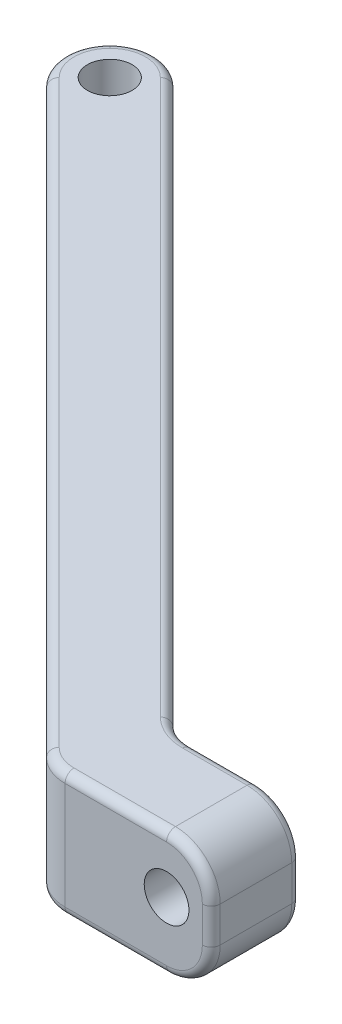
ISO-10303-21;
HEADER;
FILE_DESCRIPTION(('STEP AP214'),'2;1');
FILE_NAME('part.step','',(''),(''),'','','');
FILE_SCHEMA(('AUTOMOTIVE_DESIGN { 1 0 10303 214 1 1 1 1 }'));
ENDSEC;
DATA;
#1=APPLICATION_CONTEXT('core data for automotive mechanical design processes');
#2=APPLICATION_PROTOCOL_DEFINITION('international standard','automotive_design',2000,#1);
#3=PRODUCT_CONTEXT('',#1,'mechanical');
#4=PRODUCT('Part','Part','',(#3));
#5=PRODUCT_RELATED_PRODUCT_CATEGORY('part','',(#4));
#6=PRODUCT_DEFINITION_FORMATION('','',#4);
#7=PRODUCT_DEFINITION_CONTEXT('part definition',#1,'design');
#8=PRODUCT_DEFINITION('design','',#6,#7);
#9=PRODUCT_DEFINITION_SHAPE('','',#8);
#10=(LENGTH_UNIT() NAMED_UNIT(*) SI_UNIT(.MILLI.,.METRE.));
#11=(NAMED_UNIT(*) PLANE_ANGLE_UNIT() SI_UNIT($,.RADIAN.));
#12=(NAMED_UNIT(*) SI_UNIT($,.STERADIAN.) SOLID_ANGLE_UNIT());
#13=UNCERTAINTY_MEASURE_WITH_UNIT(LENGTH_MEASURE(1.E-05),#10,'distance_accuracy_value','');
#14=(GEOMETRIC_REPRESENTATION_CONTEXT(3) GLOBAL_UNCERTAINTY_ASSIGNED_CONTEXT((#13)) GLOBAL_UNIT_ASSIGNED_CONTEXT((#10,
#11,#12)) REPRESENTATION_CONTEXT('',''));
#15=CARTESIAN_POINT('',(0.,0.,0.));
#16=DIRECTION('',(0.,0.,1.));
#17=DIRECTION('',(1.,0.,0.));
#18=AXIS2_PLACEMENT_3D('',#15,#16,#17);
#19=CARTESIAN_POINT('',(0.,13.97,0.));
#20=DIRECTION('',(0.,-1.,0.));
#21=DIRECTION('',(0.,0.,-1.));
#22=AXIS2_PLACEMENT_3D('',#19,#20,#21);
#23=PLANE('',#22);
#24=DIRECTION('',(0.,0.,-1.));
#25=VECTOR('',#24,1.);
#26=CARTESIAN_POINT('',(76.2,13.97,0.));
#27=LINE('',#26,#25);
#28=CARTESIAN_POINT('',(76.2,13.97,68.85));
#29=VERTEX_POINT('',#28);
#30=CARTESIAN_POINT('',(76.2,13.97,60.85));
#31=VERTEX_POINT('',#30);
#32=EDGE_CURVE('E470',#29,#31,#27,.T.);
#33=ORIENTED_EDGE('',*,*,#32,.T.);
#34=DIRECTION('',(-1.,0.,0.));
#35=VECTOR('',#34,1.);
#36=CARTESIAN_POINT('',(0.,13.97,60.85));
#37=LINE('',#36,#35);
#38=CARTESIAN_POINT('',(68.9921356237317,13.97,60.85));
#39=VERTEX_POINT('',#38);
#40=EDGE_CURVE('E402',#31,#39,#37,.T.);
#41=ORIENTED_EDGE('',*,*,#40,.T.);
#42=CARTESIAN_POINT('',(68.9921356237317,13.97,54.85));
#43=DIRECTION('',(0.,-1.,0.));
#44=DIRECTION('',(0.,0.,-1.));
#45=AXIS2_PLACEMENT_3D('',#42,#43,#44);
#46=CIRCLE('',#45,6.);
#47=CARTESIAN_POINT('',(64.7494949366124,13.97,59.0926406871193));
#48=VERTEX_POINT('',#47);
#49=EDGE_CURVE('E399',#39,#48,#46,.T.);
#50=ORIENTED_EDGE('',*,*,#49,.T.);
#51=DIRECTION('',(-0.707106781186552,0.,-0.707106781186543));
#52=VECTOR('',#51,1.);
#53=CARTESIAN_POINT('',(2.82842712474617,13.97,-2.82842712474621));
#54=LINE('',#53,#52);
#55=CARTESIAN_POINT('',(2.82842712474617,13.97,-2.82842712474621));
#56=VERTEX_POINT('',#55);
#57=EDGE_CURVE('E396',#48,#56,#54,.T.);
#58=ORIENTED_EDGE('',*,*,#57,.T.);
#59=CARTESIAN_POINT('',(0.,13.97,0.));
#60=DIRECTION('',(0.,-1.,0.));
#61=DIRECTION('',(0.,0.,-1.));
#62=AXIS2_PLACEMENT_3D('',#59,#60,#61);
#63=CIRCLE('',#62,4.);
#64=CARTESIAN_POINT('',(-2.82842712474621,13.97,-2.82842712474618));
#65=VERTEX_POINT('',#64);
#66=EDGE_CURVE('E393',#56,#65,#63,.F.);
#67=ORIENTED_EDGE('',*,*,#66,.T.);
#68=CARTESIAN_POINT('',(0.,13.97,0.));
#69=DIRECTION('',(0.,-1.,0.));
#70=DIRECTION('',(0.,0.,-1.));
#71=AXIS2_PLACEMENT_3D('',#68,#69,#70);
#72=CIRCLE('',#71,4.);
#73=CARTESIAN_POINT('',(-2.82842712474617,13.97,2.82842712474621));
#74=VERTEX_POINT('',#73);
#75=EDGE_CURVE('E390',#65,#74,#72,.F.);
#76=ORIENTED_EDGE('',*,*,#75,.T.);
#77=DIRECTION('',(0.707106781186552,0.,0.707106781186543));
#78=VECTOR('',#77,1.);
#79=CARTESIAN_POINT('',(-2.82842712474618,13.97,2.82842712474621));
#80=LINE('',#79,#78);
#81=CARTESIAN_POINT('',(62.0215728752546,13.97,67.6784271247462));
#82=VERTEX_POINT('',#81);
#83=EDGE_CURVE('E387',#74,#82,#80,.T.);
#84=ORIENTED_EDGE('',*,*,#83,.T.);
#85=CARTESIAN_POINT('',(64.8500000000007,13.97,64.85));
#86=DIRECTION('',(0.,-1.,0.));
#87=DIRECTION('',(0.,0.,-1.));
#88=AXIS2_PLACEMENT_3D('',#85,#86,#87);
#89=CIRCLE('',#88,4.);
#90=CARTESIAN_POINT('',(64.8500000000007,13.97,68.85));
#91=VERTEX_POINT('',#90);
#92=EDGE_CURVE('E384',#82,#91,#89,.F.);
#93=ORIENTED_EDGE('',*,*,#92,.T.);
#94=DIRECTION('',(1.,0.,0.));
#95=VECTOR('',#94,1.);
#96=CARTESIAN_POINT('',(0.,13.97,68.85));
#97=LINE('',#96,#95);
#98=EDGE_CURVE('E381',#91,#29,#97,.T.);
#99=ORIENTED_EDGE('',*,*,#98,.T.);
#100=EDGE_LOOP('',(#33,#41,#50,#58,#67,#76,#84,#93,#99));
#101=FACE_BOUND('',#100,.T.);
#102=CARTESIAN_POINT('',(0.,13.97,0.));
#103=DIRECTION('',(0.,1.,0.));
#104=DIRECTION('',(0.,0.,1.));
#105=AXIS2_PLACEMENT_3D('',#102,#103,#104);
#106=CIRCLE('',#105,2.5);
#107=CARTESIAN_POINT('',(0.,13.97,2.5));
#108=VERTEX_POINT('',#107);
#109=EDGE_CURVE('E214',#108,#108,#106,.T.);
#110=ORIENTED_EDGE('',*,*,#109,.F.);
#111=EDGE_LOOP('',(#110));
#112=FACE_BOUND('',#111,.T.);
#113=ADVANCED_FACE('F41',(#101,#112),#23,.F.);
#114=CARTESIAN_POINT('',(0.,0.,0.));
#115=DIRECTION('',(0.,-1.,0.));
#116=DIRECTION('',(0.,0.,-1.));
#117=AXIS2_PLACEMENT_3D('',#114,#115,#116);
#118=PLANE('',#117);
#119=CARTESIAN_POINT('',(68.9921356237317,0.,54.85));
#120=DIRECTION('',(0.,-1.,0.));
#121=DIRECTION('',(0.,0.,-1.));
#122=AXIS2_PLACEMENT_3D('',#119,#120,#121);
#123=CIRCLE('',#122,6.);
#124=CARTESIAN_POINT('',(64.7494949366124,0.,59.0926406871193));
#125=VERTEX_POINT('',#124);
#126=CARTESIAN_POINT('',(68.9921356237317,0.,60.85));
#127=VERTEX_POINT('',#126);
#128=EDGE_CURVE('E196',#125,#127,#123,.F.);
#129=ORIENTED_EDGE('',*,*,#128,.T.);
#130=DIRECTION('',(-1.,0.,0.));
#131=VECTOR('',#130,1.);
#132=CARTESIAN_POINT('',(76.2,0.,60.85));
#133=LINE('',#132,#131);
#134=CARTESIAN_POINT('',(76.2,0.,60.85));
#135=VERTEX_POINT('',#134);
#136=EDGE_CURVE('E189',#127,#135,#133,.F.);
#137=ORIENTED_EDGE('',*,*,#136,.T.);
#138=DIRECTION('',(0.,0.,-1.));
#139=VECTOR('',#138,1.);
#140=CARTESIAN_POINT('',(76.2,0.,69.85));
#141=LINE('',#140,#139);
#142=CARTESIAN_POINT('',(76.2,0.,68.85));
#143=VERTEX_POINT('',#142);
#144=EDGE_CURVE('E193',#135,#143,#141,.F.);
#145=ORIENTED_EDGE('',*,*,#144,.T.);
#146=DIRECTION('',(1.,0.,0.));
#147=VECTOR('',#146,1.);
#148=CARTESIAN_POINT('',(64.8500000000007,0.,68.85));
#149=LINE('',#148,#147);
#150=CARTESIAN_POINT('',(64.8500000000007,0.,68.85));
#151=VERTEX_POINT('',#150);
#152=EDGE_CURVE('E315',#143,#151,#149,.F.);
#153=ORIENTED_EDGE('',*,*,#152,.T.);
#154=CARTESIAN_POINT('',(64.8500000000007,0.,64.85));
#155=DIRECTION('',(0.,-1.,0.));
#156=DIRECTION('',(0.,0.,-1.));
#157=AXIS2_PLACEMENT_3D('',#154,#155,#156);
#158=CIRCLE('',#157,4.);
#159=CARTESIAN_POINT('',(62.0215728752546,0.,67.6784271247462));
#160=VERTEX_POINT('',#159);
#161=EDGE_CURVE('E312',#151,#160,#158,.T.);
#162=ORIENTED_EDGE('',*,*,#161,.T.);
#163=DIRECTION('',(0.707106781186552,0.,0.707106781186543));
#164=VECTOR('',#163,1.);
#165=CARTESIAN_POINT('',(-2.82842712474617,0.,2.82842712474621));
#166=LINE('',#165,#164);
#167=CARTESIAN_POINT('',(-2.82842712474617,0.,2.82842712474621));
#168=VERTEX_POINT('',#167);
#169=EDGE_CURVE('E309',#160,#168,#166,.F.);
#170=ORIENTED_EDGE('',*,*,#169,.T.);
#171=CARTESIAN_POINT('',(0.,0.,0.));
#172=DIRECTION('',(0.,-1.,0.));
#173=DIRECTION('',(0.,0.,-1.));
#174=AXIS2_PLACEMENT_3D('',#171,#172,#173);
#175=CIRCLE('',#174,4.);
#176=CARTESIAN_POINT('',(-2.82842712474621,0.,-2.82842712474618));
#177=VERTEX_POINT('',#176);
#178=EDGE_CURVE('E318',#168,#177,#175,.T.);
#179=ORIENTED_EDGE('',*,*,#178,.T.);
#180=CARTESIAN_POINT('',(0.,0.,0.));
#181=DIRECTION('',(0.,-1.,0.));
#182=DIRECTION('',(0.,0.,-1.));
#183=AXIS2_PLACEMENT_3D('',#180,#181,#182);
#184=CIRCLE('',#183,4.);
#185=CARTESIAN_POINT('',(2.82842712474617,0.,-2.82842712474621));
#186=VERTEX_POINT('',#185);
#187=EDGE_CURVE('E322',#177,#186,#184,.T.);
#188=ORIENTED_EDGE('',*,*,#187,.T.);
#189=DIRECTION('',(-0.707106781186552,0.,-0.707106781186543));
#190=VECTOR('',#189,1.);
#191=CARTESIAN_POINT('',(64.7494949366124,0.,59.0926406871193));
#192=LINE('',#191,#190);
#193=EDGE_CURVE('E325',#186,#125,#192,.F.);
#194=ORIENTED_EDGE('',*,*,#193,.T.);
#195=EDGE_LOOP('',(#129,#137,#145,#153,#162,#170,#179,#188,#194));
#196=FACE_BOUND('',#195,.T.);
#197=CARTESIAN_POINT('',(0.,0.,0.));
#198=DIRECTION('',(0.,1.,0.));
#199=DIRECTION('',(0.,0.,1.));
#200=AXIS2_PLACEMENT_3D('',#197,#198,#199);
#201=CIRCLE('',#200,2.5);
#202=CARTESIAN_POINT('',(0.,0.,2.5));
#203=VERTEX_POINT('',#202);
#204=EDGE_CURVE('E903',#203,#203,#201,.T.);
#205=ORIENTED_EDGE('',*,*,#204,.T.);
#206=EDGE_LOOP('',(#205));
#207=FACE_BOUND('',#206,.T.);
#208=ADVANCED_FACE('F191',(#196,#207),#118,.T.);
#209=CARTESIAN_POINT('',(81.2,13.97,59.85));
#210=DIRECTION('',(-1.,0.,0.));
#211=DIRECTION('',(0.,0.,1.));
#212=AXIS2_PLACEMENT_3D('',#209,#210,#211);
#213=PLANE('',#212);
#214=DIRECTION('',(0.,0.,-1.));
#215=VECTOR('',#214,1.);
#216=CARTESIAN_POINT('',(81.2,5.,59.85));
#217=LINE('',#216,#215);
#218=CARTESIAN_POINT('',(81.2,5.,68.85));
#219=VERTEX_POINT('',#218);
#220=CARTESIAN_POINT('',(81.2,5.,60.85));
#221=VERTEX_POINT('',#220);
#222=EDGE_CURVE('E489',#219,#221,#217,.T.);
#223=ORIENTED_EDGE('',*,*,#222,.T.);
#224=DIRECTION('',(0.,-1.,0.));
#225=VECTOR('',#224,1.);
#226=CARTESIAN_POINT('',(81.2,13.97,60.85));
#227=LINE('',#226,#225);
#228=CARTESIAN_POINT('',(81.2,8.97,60.85));
#229=VERTEX_POINT('',#228);
#230=EDGE_CURVE('E372',#221,#229,#227,.F.);
#231=ORIENTED_EDGE('',*,*,#230,.T.);
#232=DIRECTION('',(0.,0.,-1.));
#233=VECTOR('',#232,1.);
#234=CARTESIAN_POINT('',(81.2,8.97,59.85));
#235=LINE('',#234,#233);
#236=CARTESIAN_POINT('',(81.2,8.97,68.85));
#237=VERTEX_POINT('',#236);
#238=EDGE_CURVE('E485',#229,#237,#235,.F.);
#239=ORIENTED_EDGE('',*,*,#238,.T.);
#240=DIRECTION('',(0.,-1.,0.));
#241=VECTOR('',#240,1.);
#242=CARTESIAN_POINT('',(81.2,13.97,68.85));
#243=LINE('',#242,#241);
#244=EDGE_CURVE('E226',#237,#219,#243,.T.);
#245=ORIENTED_EDGE('',*,*,#244,.T.);
#246=EDGE_LOOP('',(#223,#231,#239,#245));
#247=FACE_BOUND('',#246,.T.);
#248=ADVANCED_FACE('F568',(#247),#213,.F.);
#249=CARTESIAN_POINT('',(66.9210678118662,13.97,59.85));
#250=DIRECTION('',(0.,0.,1.));
#251=DIRECTION('',(1.,0.,0.));
#252=AXIS2_PLACEMENT_3D('',#249,#250,#251);
#253=PLANE('',#252);
#254=CARTESIAN_POINT('',(76.2,7.62,59.85));
#255=DIRECTION('',(0.,0.,-1.));
#256=DIRECTION('',(-1.,0.,0.));
#257=AXIS2_PLACEMENT_3D('',#254,#255,#256);
#258=CIRCLE('',#257,2.49999999999999);
#259=CARTESIAN_POINT('',(73.7,7.62,59.85));
#260=VERTEX_POINT('',#259);
#261=EDGE_CURVE('E296',#260,#260,#258,.T.);
#262=ORIENTED_EDGE('',*,*,#261,.F.);
#263=EDGE_LOOP('',(#262));
#264=FACE_BOUND('',#263,.T.);
#265=CARTESIAN_POINT('',(76.2,5.,59.85));
#266=DIRECTION('',(0.,0.,1.));
#267=DIRECTION('',(1.,0.,0.));
#268=AXIS2_PLACEMENT_3D('',#265,#266,#267);
#269=CIRCLE('',#268,4.);
#270=CARTESIAN_POINT('',(80.2,5.,59.85));
#271=VERTEX_POINT('',#270);
#272=CARTESIAN_POINT('',(76.2,0.999999999999999,59.85));
#273=VERTEX_POINT('',#272);
#274=EDGE_CURVE('E363',#271,#273,#269,.F.);
#275=ORIENTED_EDGE('',*,*,#274,.T.);
#276=DIRECTION('',(-1.,0.,0.));
#277=VECTOR('',#276,1.);
#278=CARTESIAN_POINT('',(68.9921356237317,0.999999999999999,59.85));
#279=LINE('',#278,#277);
#280=CARTESIAN_POINT('',(68.9921356237317,0.999999999999999,59.85));
#281=VERTEX_POINT('',#280);
#282=EDGE_CURVE('E229',#273,#281,#279,.T.);
#283=ORIENTED_EDGE('',*,*,#282,.T.);
#284=DIRECTION('',(0.,-1.,0.));
#285=VECTOR('',#284,1.);
#286=CARTESIAN_POINT('',(68.9921356237317,13.97,59.85));
#287=LINE('',#286,#285);
#288=CARTESIAN_POINT('',(68.9921356237317,12.97,59.85));
#289=VERTEX_POINT('',#288);
#290=EDGE_CURVE('E461',#281,#289,#287,.F.);
#291=ORIENTED_EDGE('',*,*,#290,.T.);
#292=DIRECTION('',(-1.,0.,0.));
#293=VECTOR('',#292,1.);
#294=CARTESIAN_POINT('',(66.9210678118662,12.97,59.85));
#295=LINE('',#294,#293);
#296=CARTESIAN_POINT('',(76.2,12.97,59.85));
#297=VERTEX_POINT('',#296);
#298=EDGE_CURVE('E354',#289,#297,#295,.F.);
#299=ORIENTED_EDGE('',*,*,#298,.T.);
#300=CARTESIAN_POINT('',(76.2,8.97,59.85));
#301=DIRECTION('',(0.,0.,1.));
#302=DIRECTION('',(1.,0.,0.));
#303=AXIS2_PLACEMENT_3D('',#300,#301,#302);
#304=CIRCLE('',#303,4.);
#305=CARTESIAN_POINT('',(80.2,8.97,59.85));
#306=VERTEX_POINT('',#305);
#307=EDGE_CURVE('E357',#297,#306,#304,.F.);
#308=ORIENTED_EDGE('',*,*,#307,.T.);
#309=DIRECTION('',(0.,-1.,0.));
#310=VECTOR('',#309,1.);
#311=CARTESIAN_POINT('',(80.2,13.97,59.85));
#312=LINE('',#311,#310);
#313=EDGE_CURVE('E360',#306,#271,#312,.T.);
#314=ORIENTED_EDGE('',*,*,#313,.T.);
#315=EDGE_LOOP('',(#275,#283,#291,#299,#308,#314));
#316=FACE_BOUND('',#315,.T.);
#317=ADVANCED_FACE('F557',(#264,#316),#253,.F.);
#318=CARTESIAN_POINT('',(0.,13.97,-7.07106781186548));
#319=DIRECTION('',(-0.707106781186543,0.,0.707106781186552));
#320=DIRECTION('',(0.707106781186552,0.,0.707106781186543));
#321=AXIS2_PLACEMENT_3D('',#318,#319,#320);
#322=PLANE('',#321);
#323=DIRECTION('',(0.,-1.,0.));
#324=VECTOR('',#323,1.);
#325=CARTESIAN_POINT('',(65.456601717799,0.,58.3855339059327));
#326=LINE('',#325,#324);
#327=CARTESIAN_POINT('',(65.456601717799,12.97,58.3855339059327));
#328=VERTEX_POINT('',#327);
#329=CARTESIAN_POINT('',(65.456601717799,0.999999999999999,58.3855339059327));
#330=VERTEX_POINT('',#329);
#331=EDGE_CURVE('E213',#328,#330,#326,.T.);
#332=ORIENTED_EDGE('',*,*,#331,.T.);
#333=DIRECTION('',(-0.707106781186552,0.,-0.707106781186543));
#334=VECTOR('',#333,1.);
#335=CARTESIAN_POINT('',(3.53553390593272,0.999999999999999,-3.53553390593276));
#336=LINE('',#335,#334);
#337=CARTESIAN_POINT('',(3.53553390593272,0.999999999999999,-3.53553390593276));
#338=VERTEX_POINT('',#337);
#339=EDGE_CURVE('E345',#330,#338,#336,.T.);
#340=ORIENTED_EDGE('',*,*,#339,.T.);
#341=DIRECTION('',(0.,-1.,0.));
#342=VECTOR('',#341,1.);
#343=CARTESIAN_POINT('',(3.53553390593272,13.97,-3.53553390593276));
#344=LINE('',#343,#342);
#345=CARTESIAN_POINT('',(3.53553390593272,12.97,-3.53553390593276));
#346=VERTEX_POINT('',#345);
#347=EDGE_CURVE('E467',#338,#346,#344,.F.);
#348=ORIENTED_EDGE('',*,*,#347,.T.);
#349=DIRECTION('',(-0.707106781186552,0.,-0.707106781186543));
#350=VECTOR('',#349,1.);
#351=CARTESIAN_POINT('',(0.,12.97,-7.07106781186548));
#352=LINE('',#351,#350);
#353=EDGE_CURVE('E342',#346,#328,#352,.F.);
#354=ORIENTED_EDGE('',*,*,#353,.T.);
#355=EDGE_LOOP('',(#332,#340,#348,#354));
#356=FACE_BOUND('',#355,.T.);
#357=ADVANCED_FACE('F463',(#356),#322,.F.);
#358=CARTESIAN_POINT('',(-7.07106781186547,13.97,0.));
#359=DIRECTION('',(0.707106781186543,0.,-0.707106781186552));
#360=DIRECTION('',(-0.707106781186552,0.,-0.707106781186543));
#361=AXIS2_PLACEMENT_3D('',#358,#359,#360);
#362=PLANE('',#361);
#363=DIRECTION('',(0.,-1.,0.));
#364=VECTOR('',#363,1.);
#365=CARTESIAN_POINT('',(61.314466094068,13.97,68.3855339059327));
#366=LINE('',#365,#364);
#367=CARTESIAN_POINT('',(61.314466094068,0.999999999999999,68.3855339059327));
#368=VERTEX_POINT('',#367);
#369=CARTESIAN_POINT('',(61.314466094068,12.97,68.3855339059327));
#370=VERTEX_POINT('',#369);
#371=EDGE_CURVE('E477',#368,#370,#366,.F.);
#372=ORIENTED_EDGE('',*,*,#371,.T.);
#373=DIRECTION('',(0.707106781186552,0.,0.707106781186543));
#374=VECTOR('',#373,1.);
#375=CARTESIAN_POINT('',(-7.07106781186547,12.97,0.));
#376=LINE('',#375,#374);
#377=CARTESIAN_POINT('',(-3.53553390593272,12.97,3.53553390593276));
#378=VERTEX_POINT('',#377);
#379=EDGE_CURVE('E408',#370,#378,#376,.F.);
#380=ORIENTED_EDGE('',*,*,#379,.T.);
#381=DIRECTION('',(0.,-1.,0.));
#382=VECTOR('',#381,1.);
#383=CARTESIAN_POINT('',(-3.53553390593272,13.97,3.53553390593276));
#384=LINE('',#383,#382);
#385=CARTESIAN_POINT('',(-3.53553390593272,0.999999999999999,3.53553390593276));
#386=VERTEX_POINT('',#385);
#387=EDGE_CURVE('E481',#378,#386,#384,.T.);
#388=ORIENTED_EDGE('',*,*,#387,.T.);
#389=DIRECTION('',(0.707106781186552,0.,0.707106781186543));
#390=VECTOR('',#389,1.);
#391=CARTESIAN_POINT('',(61.314466094068,0.999999999999999,68.3855339059327));
#392=LINE('',#391,#390);
#393=EDGE_CURVE('E405',#386,#368,#392,.T.);
#394=ORIENTED_EDGE('',*,*,#393,.T.);
#395=EDGE_LOOP('',(#372,#380,#388,#394));
#396=FACE_BOUND('',#395,.T.);
#397=ADVANCED_FACE('F603',(#396),#362,.F.);
#398=CARTESIAN_POINT('',(81.2,13.97,69.85));
#399=DIRECTION('',(0.,0.,-1.));
#400=DIRECTION('',(-1.,0.,0.));
#401=AXIS2_PLACEMENT_3D('',#398,#399,#400);
#402=PLANE('',#401);
#403=CARTESIAN_POINT('',(76.2,7.62,69.85));
#404=DIRECTION('',(0.,0.,-1.));
#405=DIRECTION('',(-1.,0.,0.));
#406=AXIS2_PLACEMENT_3D('',#403,#404,#405);
#407=CIRCLE('',#406,2.49999999999999);
#408=CARTESIAN_POINT('',(73.7,7.62,69.85));
#409=VERTEX_POINT('',#408);
#410=EDGE_CURVE('E303',#409,#409,#407,.F.);
#411=ORIENTED_EDGE('',*,*,#410,.F.);
#412=EDGE_LOOP('',(#411));
#413=FACE_BOUND('',#412,.T.);
#414=CARTESIAN_POINT('',(76.2,8.97,69.85));
#415=DIRECTION('',(0.,0.,-1.));
#416=DIRECTION('',(-1.,0.,0.));
#417=AXIS2_PLACEMENT_3D('',#414,#415,#416);
#418=CIRCLE('',#417,4.);
#419=CARTESIAN_POINT('',(80.2,8.97,69.85));
#420=VERTEX_POINT('',#419);
#421=CARTESIAN_POINT('',(76.2,12.97,69.85));
#422=VERTEX_POINT('',#421);
#423=EDGE_CURVE('E51',#420,#422,#418,.F.);
#424=ORIENTED_EDGE('',*,*,#423,.T.);
#425=DIRECTION('',(1.,0.,0.));
#426=VECTOR('',#425,1.);
#427=CARTESIAN_POINT('',(81.2,12.97,69.85));
#428=LINE('',#427,#426);
#429=CARTESIAN_POINT('',(64.8500000000007,12.97,69.85));
#430=VERTEX_POINT('',#429);
#431=EDGE_CURVE('E11',#422,#430,#428,.F.);
#432=ORIENTED_EDGE('',*,*,#431,.T.);
#433=DIRECTION('',(0.,-1.,0.));
#434=VECTOR('',#433,1.);
#435=CARTESIAN_POINT('',(64.8500000000007,13.97,69.85));
#436=LINE('',#435,#434);
#437=CARTESIAN_POINT('',(64.8500000000007,0.999999999999999,69.85));
#438=VERTEX_POINT('',#437);
#439=EDGE_CURVE('E307',#430,#438,#436,.T.);
#440=ORIENTED_EDGE('',*,*,#439,.T.);
#441=DIRECTION('',(1.,0.,0.));
#442=VECTOR('',#441,1.);
#443=CARTESIAN_POINT('',(76.2,0.999999999999999,69.85));
#444=LINE('',#443,#442);
#445=CARTESIAN_POINT('',(76.2,0.999999999999999,69.85));
#446=VERTEX_POINT('',#445);
#447=EDGE_CURVE('E417',#438,#446,#444,.T.);
#448=ORIENTED_EDGE('',*,*,#447,.T.);
#449=CARTESIAN_POINT('',(76.2,5.,69.85));
#450=DIRECTION('',(0.,0.,-1.));
#451=DIRECTION('',(-1.,0.,0.));
#452=AXIS2_PLACEMENT_3D('',#449,#450,#451);
#453=CIRCLE('',#452,4.);
#454=CARTESIAN_POINT('',(80.2,5.,69.85));
#455=VERTEX_POINT('',#454);
#456=EDGE_CURVE('E420',#446,#455,#453,.F.);
#457=ORIENTED_EDGE('',*,*,#456,.T.);
#458=DIRECTION('',(0.,-1.,0.));
#459=VECTOR('',#458,1.);
#460=CARTESIAN_POINT('',(80.2,13.97,69.85));
#461=LINE('',#460,#459);
#462=EDGE_CURVE('E62',#455,#420,#461,.F.);
#463=ORIENTED_EDGE('',*,*,#462,.T.);
#464=EDGE_LOOP('',(#424,#432,#440,#448,#457,#463));
#465=FACE_BOUND('',#464,.T.);
#466=ADVANCED_FACE('F498',(#413,#465),#402,.F.);
#467=CARTESIAN_POINT('',(0.,13.97,0.));
#468=DIRECTION('',(0.,-1.,0.));
#469=DIRECTION('',(0.,0.,-1.));
#470=AXIS2_PLACEMENT_3D('',#467,#468,#469);
#471=CYLINDRICAL_SURFACE('',#470,2.5);
#472=ORIENTED_EDGE('',*,*,#109,.T.);
#473=EDGE_LOOP('',(#472));
#474=FACE_BOUND('',#473,.T.);
#475=ORIENTED_EDGE('',*,*,#204,.F.);
#476=EDGE_LOOP('',(#475));
#477=FACE_BOUND('',#476,.T.);
#478=ADVANCED_FACE('F598',(#474,#477),#471,.F.);
#479=CARTESIAN_POINT('',(76.2,7.62,69.851));
#480=DIRECTION('',(0.,0.,-1.));
#481=DIRECTION('',(-1.,0.,0.));
#482=AXIS2_PLACEMENT_3D('',#479,#480,#481);
#483=CYLINDRICAL_SURFACE('',#482,2.49999999999999);
#484=ORIENTED_EDGE('',*,*,#261,.T.);
#485=EDGE_LOOP('',(#484));
#486=FACE_BOUND('',#485,.T.);
#487=ORIENTED_EDGE('',*,*,#410,.T.);
#488=EDGE_LOOP('',(#487));
#489=FACE_BOUND('',#488,.T.);
#490=ADVANCED_FACE('F619',(#486,#489),#483,.F.);
#491=CARTESIAN_POINT('',(0.,13.97,0.));
#492=DIRECTION('',(0.,-1.,0.));
#493=DIRECTION('',(0.,0.,-1.));
#494=AXIS2_PLACEMENT_3D('',#491,#492,#493);
#495=CYLINDRICAL_SURFACE('',#494,5.);
#496=DIRECTION('',(0.,-1.,0.));
#497=VECTOR('',#496,1.);
#498=CARTESIAN_POINT('',(-3.53553390593276,13.97,-3.53553390593272));
#499=LINE('',#498,#497);
#500=CARTESIAN_POINT('',(-3.53553390593276,0.999999999999999,-3.53553390593272));
#501=VERTEX_POINT('',#500);
#502=CARTESIAN_POINT('',(-3.53553390593276,12.97,-3.53553390593272));
#503=VERTEX_POINT('',#502);
#504=EDGE_CURVE('E289',#501,#503,#499,.F.);
#505=ORIENTED_EDGE('',*,*,#504,.F.);
#506=CARTESIAN_POINT('',(0.,0.999999999999999,0.));
#507=DIRECTION('',(0.,-1.,0.));
#508=DIRECTION('',(0.,0.,-1.));
#509=AXIS2_PLACEMENT_3D('',#506,#507,#508);
#510=CIRCLE('',#509,5.);
#511=EDGE_CURVE('E332',#501,#386,#510,.F.);
#512=ORIENTED_EDGE('',*,*,#511,.T.);
#513=ORIENTED_EDGE('',*,*,#387,.F.);
#514=CARTESIAN_POINT('',(0.,12.97,0.));
#515=DIRECTION('',(0.,-1.,0.));
#516=DIRECTION('',(0.,0.,-1.));
#517=AXIS2_PLACEMENT_3D('',#514,#515,#516);
#518=CIRCLE('',#517,5.);
#519=EDGE_CURVE('E202',#378,#503,#518,.T.);
#520=ORIENTED_EDGE('',*,*,#519,.T.);
#521=EDGE_LOOP('',(#505,#512,#513,#520));
#522=FACE_BOUND('',#521,.T.);
#523=ADVANCED_FACE('F531',(#522),#495,.T.);
#524=CARTESIAN_POINT('',(0.,13.97,0.));
#525=DIRECTION('',(0.,-1.,0.));
#526=DIRECTION('',(0.,0.,-1.));
#527=AXIS2_PLACEMENT_3D('',#524,#525,#526);
#528=CYLINDRICAL_SURFACE('',#527,5.);
#529=ORIENTED_EDGE('',*,*,#347,.F.);
#530=CARTESIAN_POINT('',(0.,0.999999999999999,0.));
#531=DIRECTION('',(0.,-1.,0.));
#532=DIRECTION('',(0.,0.,-1.));
#533=AXIS2_PLACEMENT_3D('',#530,#531,#532);
#534=CIRCLE('',#533,5.);
#535=EDGE_CURVE('E339',#338,#501,#534,.F.);
#536=ORIENTED_EDGE('',*,*,#535,.T.);
#537=ORIENTED_EDGE('',*,*,#504,.T.);
#538=CARTESIAN_POINT('',(0.,12.97,0.));
#539=DIRECTION('',(0.,-1.,0.));
#540=DIRECTION('',(0.,0.,-1.));
#541=AXIS2_PLACEMENT_3D('',#538,#539,#540);
#542=CIRCLE('',#541,5.);
#543=EDGE_CURVE('E336',#503,#346,#542,.T.);
#544=ORIENTED_EDGE('',*,*,#543,.T.);
#545=EDGE_LOOP('',(#529,#536,#537,#544));
#546=FACE_BOUND('',#545,.T.);
#547=ADVANCED_FACE('F529',(#546),#528,.T.);
#548=CARTESIAN_POINT('',(76.2,5.,59.85));
#549=DIRECTION('',(0.,0.,1.));
#550=DIRECTION('',(1.,0.,0.));
#551=AXIS2_PLACEMENT_3D('',#548,#549,#550);
#552=CYLINDRICAL_SURFACE('',#551,5.);
#553=ORIENTED_EDGE('',*,*,#144,.F.);
#554=CARTESIAN_POINT('',(76.2,5.,60.85));
#555=DIRECTION('',(0.,0.,1.));
#556=DIRECTION('',(1.,0.,0.));
#557=AXIS2_PLACEMENT_3D('',#554,#555,#556);
#558=CIRCLE('',#557,5.);
#559=EDGE_CURVE('E208',#135,#221,#558,.T.);
#560=ORIENTED_EDGE('',*,*,#559,.T.);
#561=ORIENTED_EDGE('',*,*,#222,.F.);
#562=CARTESIAN_POINT('',(76.2,5.,68.85));
#563=DIRECTION('',(0.,0.,-1.));
#564=DIRECTION('',(-1.,0.,0.));
#565=AXIS2_PLACEMENT_3D('',#562,#563,#564);
#566=CIRCLE('',#565,5.);
#567=EDGE_CURVE('E211',#219,#143,#566,.T.);
#568=ORIENTED_EDGE('',*,*,#567,.T.);
#569=EDGE_LOOP('',(#553,#560,#561,#568));
#570=FACE_BOUND('',#569,.T.);
#571=ADVANCED_FACE('F206',(#570),#552,.T.);
#572=CARTESIAN_POINT('',(76.2,8.97,0.));
#573=DIRECTION('',(0.,0.,-1.));
#574=DIRECTION('',(-1.,0.,0.));
#575=AXIS2_PLACEMENT_3D('',#572,#573,#574);
#576=CYLINDRICAL_SURFACE('',#575,5.);
#577=ORIENTED_EDGE('',*,*,#238,.F.);
#578=CARTESIAN_POINT('',(76.2,8.97,60.85));
#579=DIRECTION('',(0.,0.,1.));
#580=DIRECTION('',(1.,0.,0.));
#581=AXIS2_PLACEMENT_3D('',#578,#579,#580);
#582=CIRCLE('',#581,5.);
#583=EDGE_CURVE('E378',#229,#31,#582,.T.);
#584=ORIENTED_EDGE('',*,*,#583,.T.);
#585=ORIENTED_EDGE('',*,*,#32,.F.);
#586=CARTESIAN_POINT('',(76.2,8.97,68.85));
#587=DIRECTION('',(0.,0.,-1.));
#588=DIRECTION('',(-1.,0.,0.));
#589=AXIS2_PLACEMENT_3D('',#586,#587,#588);
#590=CIRCLE('',#589,5.);
#591=EDGE_CURVE('E375',#29,#237,#590,.T.);
#592=ORIENTED_EDGE('',*,*,#591,.T.);
#593=EDGE_LOOP('',(#577,#584,#585,#592));
#594=FACE_BOUND('',#593,.T.);
#595=ADVANCED_FACE('F571',(#594),#576,.T.);
#596=CARTESIAN_POINT('',(64.8500000000007,13.97,64.85));
#597=DIRECTION('',(0.,-1.,0.));
#598=DIRECTION('',(0.,0.,-1.));
#599=AXIS2_PLACEMENT_3D('',#596,#597,#598);
#600=CYLINDRICAL_SURFACE('',#599,5.);
#601=ORIENTED_EDGE('',*,*,#439,.F.);
#602=CARTESIAN_POINT('',(64.8500000000007,12.97,64.85));
#603=DIRECTION('',(0.,-1.,0.));
#604=DIRECTION('',(0.,0.,-1.));
#605=AXIS2_PLACEMENT_3D('',#602,#603,#604);
#606=CIRCLE('',#605,5.);
#607=EDGE_CURVE('E414',#430,#370,#606,.T.);
#608=ORIENTED_EDGE('',*,*,#607,.T.);
#609=ORIENTED_EDGE('',*,*,#371,.F.);
#610=CARTESIAN_POINT('',(64.8500000000007,0.999999999999999,64.85));
#611=DIRECTION('',(0.,-1.,0.));
#612=DIRECTION('',(0.,0.,-1.));
#613=AXIS2_PLACEMENT_3D('',#610,#611,#612);
#614=CIRCLE('',#613,5.);
#615=EDGE_CURVE('E411',#368,#438,#614,.F.);
#616=ORIENTED_EDGE('',*,*,#615,.T.);
#617=EDGE_LOOP('',(#601,#608,#609,#616));
#618=FACE_BOUND('',#617,.T.);
#619=ADVANCED_FACE('F624',(#618),#600,.T.);
#620=CARTESIAN_POINT('',(68.9921356237317,13.97,54.85));
#621=DIRECTION('',(0.,1.,0.));
#622=DIRECTION('',(0.,0.,1.));
#623=AXIS2_PLACEMENT_3D('',#620,#621,#622);
#624=CYLINDRICAL_SURFACE('',#623,5.);
#625=ORIENTED_EDGE('',*,*,#290,.F.);
#626=CARTESIAN_POINT('',(68.9921356237317,0.999999999999999,54.85));
#627=DIRECTION('',(0.,-1.,0.));
#628=DIRECTION('',(0.,0.,-1.));
#629=AXIS2_PLACEMENT_3D('',#626,#627,#628);
#630=CIRCLE('',#629,5.);
#631=EDGE_CURVE('E351',#281,#330,#630,.T.);
#632=ORIENTED_EDGE('',*,*,#631,.T.);
#633=ORIENTED_EDGE('',*,*,#331,.F.);
#634=CARTESIAN_POINT('',(68.9921356237317,12.97,54.85));
#635=DIRECTION('',(0.,-1.,0.));
#636=DIRECTION('',(0.,0.,-1.));
#637=AXIS2_PLACEMENT_3D('',#634,#635,#636);
#638=CIRCLE('',#637,5.);
#639=EDGE_CURVE('E348',#328,#289,#638,.F.);
#640=ORIENTED_EDGE('',*,*,#639,.T.);
#641=EDGE_LOOP('',(#625,#632,#633,#640));
#642=FACE_BOUND('',#641,.T.);
#643=ADVANCED_FACE('F458',(#642),#624,.F.);
#644=CARTESIAN_POINT('',(0.,12.97,0.));
#645=DIRECTION('',(0.,-1.,0.));
#646=DIRECTION('',(0.,0.,-1.));
#647=AXIS2_PLACEMENT_3D('',#644,#645,#646);
#648=TOROIDAL_SURFACE('',#647,4.,1.);
#649=CARTESIAN_POINT('',(2.82842712474617,12.97,-2.82842712474621));
#650=DIRECTION('',(0.707106781186552,0.,0.707106781186543));
#651=DIRECTION('',(0.707106781186543,0.,-0.707106781186552));
#652=AXIS2_PLACEMENT_3D('',#649,#650,#651);
#653=CIRCLE('',#652,1.);
#654=EDGE_CURVE('E280',#346,#56,#653,.T.);
#655=ORIENTED_EDGE('',*,*,#654,.F.);
#656=ORIENTED_EDGE('',*,*,#543,.F.);
#657=CARTESIAN_POINT('',(-2.82842712474621,12.97,-2.82842712474618));
#658=DIRECTION('',(-0.707106781186543,0.,0.707106781186552));
#659=DIRECTION('',(0.707106781186552,0.,0.707106781186543));
#660=AXIS2_PLACEMENT_3D('',#657,#658,#659);
#661=CIRCLE('',#660,1.);
#662=EDGE_CURVE('E45',#65,#503,#661,.T.);
#663=ORIENTED_EDGE('',*,*,#662,.F.);
#664=ORIENTED_EDGE('',*,*,#66,.F.);
#665=EDGE_LOOP('',(#655,#656,#663,#664));
#666=FACE_BOUND('',#665,.T.);
#667=ADVANCED_FACE('F43',(#666),#648,.T.);
#668=CARTESIAN_POINT('',(0.,12.97,0.));
#669=DIRECTION('',(0.,-1.,0.));
#670=DIRECTION('',(0.,0.,-1.));
#671=AXIS2_PLACEMENT_3D('',#668,#669,#670);
#672=TOROIDAL_SURFACE('',#671,4.,1.);
#673=ORIENTED_EDGE('',*,*,#662,.T.);
#674=ORIENTED_EDGE('',*,*,#519,.F.);
#675=CARTESIAN_POINT('',(-2.82842712474617,12.97,2.82842712474621));
#676=DIRECTION('',(0.707106781186552,0.,0.707106781186543));
#677=DIRECTION('',(0.707106781186543,0.,-0.707106781186552));
#678=AXIS2_PLACEMENT_3D('',#675,#676,#677);
#679=CIRCLE('',#678,1.);
#680=EDGE_CURVE('E277',#74,#378,#679,.T.);
#681=ORIENTED_EDGE('',*,*,#680,.F.);
#682=ORIENTED_EDGE('',*,*,#75,.F.);
#683=EDGE_LOOP('',(#673,#674,#681,#682));
#684=FACE_BOUND('',#683,.T.);
#685=ADVANCED_FACE('F534',(#684),#672,.T.);
#686=CARTESIAN_POINT('',(2.82842712474617,12.97,-2.82842712474621));
#687=DIRECTION('',(-0.707106781186552,0.,-0.707106781186543));
#688=DIRECTION('',(-0.707106781186543,0.,0.707106781186552));
#689=AXIS2_PLACEMENT_3D('',#686,#687,#688);
#690=CYLINDRICAL_SURFACE('',#689,1.);
#691=ORIENTED_EDGE('',*,*,#654,.T.);
#692=ORIENTED_EDGE('',*,*,#57,.F.);
#693=CARTESIAN_POINT('',(64.7494949366124,12.97,59.0926406871193));
#694=DIRECTION('',(0.707106781186551,0.,0.707106781186544));
#695=DIRECTION('',(0.707106781186544,0.,-0.707106781186551));
#696=AXIS2_PLACEMENT_3D('',#693,#694,#695);
#697=CIRCLE('',#696,1.);
#698=EDGE_CURVE('E273',#328,#48,#697,.T.);
#699=ORIENTED_EDGE('',*,*,#698,.F.);
#700=ORIENTED_EDGE('',*,*,#353,.F.);
#701=EDGE_LOOP('',(#691,#692,#699,#700));
#702=FACE_BOUND('',#701,.T.);
#703=ADVANCED_FACE('F546',(#702),#690,.T.);
#704=CARTESIAN_POINT('',(-2.82842712474617,12.97,2.82842712474621));
#705=DIRECTION('',(0.707106781186552,0.,0.707106781186543));
#706=DIRECTION('',(0.707106781186543,0.,-0.707106781186552));
#707=AXIS2_PLACEMENT_3D('',#704,#705,#706);
#708=CYLINDRICAL_SURFACE('',#707,1.);
#709=ORIENTED_EDGE('',*,*,#680,.T.);
#710=ORIENTED_EDGE('',*,*,#379,.F.);
#711=CARTESIAN_POINT('',(62.0215728752545,12.97,67.6784271247462));
#712=DIRECTION('',(0.707106781186548,0.,0.707106781186548));
#713=DIRECTION('',(0.707106781186548,0.,-0.707106781186548));
#714=AXIS2_PLACEMENT_3D('',#711,#712,#713);
#715=CIRCLE('',#714,1.);
#716=EDGE_CURVE('E269',#82,#370,#715,.T.);
#717=ORIENTED_EDGE('',*,*,#716,.F.);
#718=ORIENTED_EDGE('',*,*,#83,.F.);
#719=EDGE_LOOP('',(#709,#710,#717,#718));
#720=FACE_BOUND('',#719,.T.);
#721=ADVANCED_FACE('F538',(#720),#708,.T.);
#722=CARTESIAN_POINT('',(68.9921356237317,12.97,54.85));
#723=DIRECTION('',(0.,-1.,0.));
#724=DIRECTION('',(0.,0.,-1.));
#725=AXIS2_PLACEMENT_3D('',#722,#723,#724);
#726=TOROIDAL_SURFACE('',#725,6.,1.);
#727=ORIENTED_EDGE('',*,*,#698,.T.);
#728=ORIENTED_EDGE('',*,*,#49,.F.);
#729=CARTESIAN_POINT('',(68.9921356237317,12.97,60.85));
#730=DIRECTION('',(1.,0.,0.));
#731=DIRECTION('',(0.,0.,-1.));
#732=AXIS2_PLACEMENT_3D('',#729,#730,#731);
#733=CIRCLE('',#732,1.);
#734=EDGE_CURVE('E265',#289,#39,#733,.T.);
#735=ORIENTED_EDGE('',*,*,#734,.F.);
#736=ORIENTED_EDGE('',*,*,#639,.F.);
#737=EDGE_LOOP('',(#727,#728,#735,#736));
#738=FACE_BOUND('',#737,.T.);
#739=ADVANCED_FACE('F550',(#738),#726,.T.);
#740=CARTESIAN_POINT('',(64.8500000000007,12.97,64.85));
#741=DIRECTION('',(0.,-1.,0.));
#742=DIRECTION('',(0.,0.,-1.));
#743=AXIS2_PLACEMENT_3D('',#740,#741,#742);
#744=TOROIDAL_SURFACE('',#743,4.,1.);
#745=ORIENTED_EDGE('',*,*,#716,.T.);
#746=ORIENTED_EDGE('',*,*,#607,.F.);
#747=CARTESIAN_POINT('',(64.8500000000007,12.97,68.85));
#748=DIRECTION('',(1.,0.,0.));
#749=DIRECTION('',(0.,0.,-1.));
#750=AXIS2_PLACEMENT_3D('',#747,#748,#749);
#751=CIRCLE('',#750,1.);
#752=EDGE_CURVE('E261',#91,#430,#751,.T.);
#753=ORIENTED_EDGE('',*,*,#752,.F.);
#754=ORIENTED_EDGE('',*,*,#92,.F.);
#755=EDGE_LOOP('',(#745,#746,#753,#754));
#756=FACE_BOUND('',#755,.T.);
#757=ADVANCED_FACE('F748',(#756),#744,.T.);
#758=CARTESIAN_POINT('',(0.,12.97,60.85));
#759=DIRECTION('',(-1.,0.,0.));
#760=DIRECTION('',(0.,0.,1.));
#761=AXIS2_PLACEMENT_3D('',#758,#759,#760);
#762=CYLINDRICAL_SURFACE('',#761,1.);
#763=ORIENTED_EDGE('',*,*,#734,.T.);
#764=ORIENTED_EDGE('',*,*,#40,.F.);
#765=CARTESIAN_POINT('',(76.2,12.97,60.85));
#766=DIRECTION('',(1.,0.,0.));
#767=DIRECTION('',(0.,0.,-1.));
#768=AXIS2_PLACEMENT_3D('',#765,#766,#767);
#769=CIRCLE('',#768,1.);
#770=EDGE_CURVE('E257',#297,#31,#769,.T.);
#771=ORIENTED_EDGE('',*,*,#770,.F.);
#772=ORIENTED_EDGE('',*,*,#298,.F.);
#773=EDGE_LOOP('',(#763,#764,#771,#772));
#774=FACE_BOUND('',#773,.T.);
#775=ADVANCED_FACE('F555',(#774),#762,.T.);
#776=CARTESIAN_POINT('',(0.,12.97,68.85));
#777=DIRECTION('',(1.,0.,0.));
#778=DIRECTION('',(0.,0.,-1.));
#779=AXIS2_PLACEMENT_3D('',#776,#777,#778);
#780=CYLINDRICAL_SURFACE('',#779,1.);
#781=ORIENTED_EDGE('',*,*,#752,.T.);
#782=ORIENTED_EDGE('',*,*,#431,.F.);
#783=CARTESIAN_POINT('',(76.2,12.97,68.85));
#784=DIRECTION('',(1.,0.,0.));
#785=DIRECTION('',(0.,0.,-1.));
#786=AXIS2_PLACEMENT_3D('',#783,#784,#785);
#787=CIRCLE('',#786,1.);
#788=EDGE_CURVE('E253',#29,#422,#787,.T.);
#789=ORIENTED_EDGE('',*,*,#788,.F.);
#790=ORIENTED_EDGE('',*,*,#98,.F.);
#791=EDGE_LOOP('',(#781,#782,#789,#790));
#792=FACE_BOUND('',#791,.T.);
#793=ADVANCED_FACE('F732',(#792),#780,.T.);
#794=CARTESIAN_POINT('',(76.2,8.97,60.85));
#795=DIRECTION('',(0.,0.,1.));
#796=DIRECTION('',(1.,0.,0.));
#797=AXIS2_PLACEMENT_3D('',#794,#795,#796);
#798=TOROIDAL_SURFACE('',#797,4.,1.);
#799=ORIENTED_EDGE('',*,*,#770,.T.);
#800=ORIENTED_EDGE('',*,*,#583,.F.);
#801=CARTESIAN_POINT('',(80.2,8.97,60.85));
#802=DIRECTION('',(0.,-1.,0.));
#803=DIRECTION('',(0.,0.,-1.));
#804=AXIS2_PLACEMENT_3D('',#801,#802,#803);
#805=CIRCLE('',#804,1.);
#806=EDGE_CURVE('E249',#306,#229,#805,.T.);
#807=ORIENTED_EDGE('',*,*,#806,.F.);
#808=ORIENTED_EDGE('',*,*,#307,.F.);
#809=EDGE_LOOP('',(#799,#800,#807,#808));
#810=FACE_BOUND('',#809,.T.);
#811=ADVANCED_FACE('F562',(#810),#798,.T.);
#812=CARTESIAN_POINT('',(76.2,8.97,68.85));
#813=DIRECTION('',(0.,0.,-1.));
#814=DIRECTION('',(-1.,0.,0.));
#815=AXIS2_PLACEMENT_3D('',#812,#813,#814);
#816=TOROIDAL_SURFACE('',#815,4.,1.);
#817=ORIENTED_EDGE('',*,*,#788,.T.);
#818=ORIENTED_EDGE('',*,*,#423,.F.);
#819=CARTESIAN_POINT('',(80.2,8.97,68.85));
#820=DIRECTION('',(0.,-1.,0.));
#821=DIRECTION('',(0.,0.,-1.));
#822=AXIS2_PLACEMENT_3D('',#819,#820,#821);
#823=CIRCLE('',#822,1.);
#824=EDGE_CURVE('E245',#237,#420,#823,.T.);
#825=ORIENTED_EDGE('',*,*,#824,.F.);
#826=ORIENTED_EDGE('',*,*,#591,.F.);
#827=EDGE_LOOP('',(#817,#818,#825,#826));
#828=FACE_BOUND('',#827,.T.);
#829=ADVANCED_FACE('F576',(#828),#816,.T.);
#830=CARTESIAN_POINT('',(80.2,13.97,60.85));
#831=DIRECTION('',(0.,-1.,0.));
#832=DIRECTION('',(0.,0.,-1.));
#833=AXIS2_PLACEMENT_3D('',#830,#831,#832);
#834=CYLINDRICAL_SURFACE('',#833,1.);
#835=ORIENTED_EDGE('',*,*,#806,.T.);
#836=ORIENTED_EDGE('',*,*,#230,.F.);
#837=CARTESIAN_POINT('',(80.2,5.,60.85));
#838=DIRECTION('',(0.,-1.,0.));
#839=DIRECTION('',(0.,0.,-1.));
#840=AXIS2_PLACEMENT_3D('',#837,#838,#839);
#841=CIRCLE('',#840,1.);
#842=EDGE_CURVE('E224',#271,#221,#841,.T.);
#843=ORIENTED_EDGE('',*,*,#842,.F.);
#844=ORIENTED_EDGE('',*,*,#313,.F.);
#845=EDGE_LOOP('',(#835,#836,#843,#844));
#846=FACE_BOUND('',#845,.T.);
#847=ADVANCED_FACE('F565',(#846),#834,.T.);
#848=CARTESIAN_POINT('',(80.2,13.97,68.85));
#849=DIRECTION('',(0.,-1.,0.));
#850=DIRECTION('',(0.,0.,-1.));
#851=AXIS2_PLACEMENT_3D('',#848,#849,#850);
#852=CYLINDRICAL_SURFACE('',#851,1.);
#853=ORIENTED_EDGE('',*,*,#824,.T.);
#854=ORIENTED_EDGE('',*,*,#462,.F.);
#855=CARTESIAN_POINT('',(80.2,5.,68.85));
#856=DIRECTION('',(0.,-1.,0.));
#857=DIRECTION('',(0.,0.,-1.));
#858=AXIS2_PLACEMENT_3D('',#855,#856,#857);
#859=CIRCLE('',#858,1.);
#860=EDGE_CURVE('E231',#219,#455,#859,.T.);
#861=ORIENTED_EDGE('',*,*,#860,.F.);
#862=ORIENTED_EDGE('',*,*,#244,.F.);
#863=EDGE_LOOP('',(#853,#854,#861,#862));
#864=FACE_BOUND('',#863,.T.);
#865=ADVANCED_FACE('F580',(#864),#852,.T.);
#866=CARTESIAN_POINT('',(76.2,5.,60.85));
#867=DIRECTION('',(0.,0.,1.));
#868=DIRECTION('',(1.,0.,0.));
#869=AXIS2_PLACEMENT_3D('',#866,#867,#868);
#870=TOROIDAL_SURFACE('',#869,4.,1.);
#871=ORIENTED_EDGE('',*,*,#842,.T.);
#872=ORIENTED_EDGE('',*,*,#559,.F.);
#873=CARTESIAN_POINT('',(76.2,0.999999999999999,60.85));
#874=DIRECTION('',(-1.,0.,0.));
#875=DIRECTION('',(0.,0.,1.));
#876=AXIS2_PLACEMENT_3D('',#873,#874,#875);
#877=CIRCLE('',#876,1.);
#878=EDGE_CURVE('E221',#273,#135,#877,.T.);
#879=ORIENTED_EDGE('',*,*,#878,.F.);
#880=ORIENTED_EDGE('',*,*,#274,.F.);
#881=EDGE_LOOP('',(#871,#872,#879,#880));
#882=FACE_BOUND('',#881,.T.);
#883=ADVANCED_FACE('F219',(#882),#870,.T.);
#884=CARTESIAN_POINT('',(76.2,5.,68.85));
#885=DIRECTION('',(0.,0.,-1.));
#886=DIRECTION('',(-1.,0.,0.));
#887=AXIS2_PLACEMENT_3D('',#884,#885,#886);
#888=TOROIDAL_SURFACE('',#887,4.,1.);
#889=ORIENTED_EDGE('',*,*,#860,.T.);
#890=ORIENTED_EDGE('',*,*,#456,.F.);
#891=CARTESIAN_POINT('',(76.2,0.999999999999999,68.85));
#892=DIRECTION('',(-1.,0.,0.));
#893=DIRECTION('',(0.,0.,1.));
#894=AXIS2_PLACEMENT_3D('',#891,#892,#893);
#895=CIRCLE('',#894,1.);
#896=EDGE_CURVE('E232',#143,#446,#895,.T.);
#897=ORIENTED_EDGE('',*,*,#896,.F.);
#898=ORIENTED_EDGE('',*,*,#567,.F.);
#899=EDGE_LOOP('',(#889,#890,#897,#898));
#900=FACE_BOUND('',#899,.T.);
#901=ADVANCED_FACE('F582',(#900),#888,.T.);
#902=CARTESIAN_POINT('',(66.9210678118662,0.999999999999999,60.85));
#903=DIRECTION('',(1.,0.,0.));
#904=DIRECTION('',(0.,0.,-1.));
#905=AXIS2_PLACEMENT_3D('',#902,#903,#904);
#906=CYLINDRICAL_SURFACE('',#905,1.);
#907=ORIENTED_EDGE('',*,*,#878,.T.);
#908=ORIENTED_EDGE('',*,*,#136,.F.);
#909=CARTESIAN_POINT('',(68.9921356237317,0.999999999999999,60.85));
#910=DIRECTION('',(-1.,0.,0.));
#911=DIRECTION('',(0.,0.,1.));
#912=AXIS2_PLACEMENT_3D('',#909,#910,#911);
#913=CIRCLE('',#912,1.);
#914=EDGE_CURVE('E239',#281,#127,#913,.T.);
#915=ORIENTED_EDGE('',*,*,#914,.F.);
#916=ORIENTED_EDGE('',*,*,#282,.F.);
#917=EDGE_LOOP('',(#907,#908,#915,#916));
#918=FACE_BOUND('',#917,.T.);
#919=ADVANCED_FACE('F228',(#918),#906,.T.);
#920=CARTESIAN_POINT('',(81.2,0.999999999999999,68.85));
#921=DIRECTION('',(-1.,0.,0.));
#922=DIRECTION('',(0.,0.,1.));
#923=AXIS2_PLACEMENT_3D('',#920,#921,#922);
#924=CYLINDRICAL_SURFACE('',#923,1.);
#925=ORIENTED_EDGE('',*,*,#896,.T.);
#926=ORIENTED_EDGE('',*,*,#447,.F.);
#927=CARTESIAN_POINT('',(64.8500000000007,1.,68.85));
#928=DIRECTION('',(-1.,0.,0.));
#929=DIRECTION('',(0.,0.,1.));
#930=AXIS2_PLACEMENT_3D('',#927,#928,#929);
#931=CIRCLE('',#930,1.);
#932=EDGE_CURVE('E445',#151,#438,#931,.T.);
#933=ORIENTED_EDGE('',*,*,#932,.F.);
#934=ORIENTED_EDGE('',*,*,#152,.F.);
#935=EDGE_LOOP('',(#925,#926,#933,#934));
#936=FACE_BOUND('',#935,.T.);
#937=ADVANCED_FACE('F504',(#936),#924,.T.);
#938=CARTESIAN_POINT('',(68.9921356237317,0.999999999999999,54.85));
#939=DIRECTION('',(0.,-1.,0.));
#940=DIRECTION('',(0.,0.,-1.));
#941=AXIS2_PLACEMENT_3D('',#938,#939,#940);
#942=TOROIDAL_SURFACE('',#941,6.,1.);
#943=ORIENTED_EDGE('',*,*,#914,.T.);
#944=ORIENTED_EDGE('',*,*,#128,.F.);
#945=CARTESIAN_POINT('',(64.7494949366124,0.999999999999999,59.0926406871193));
#946=DIRECTION('',(-0.707106781186551,0.,-0.707106781186544));
#947=DIRECTION('',(-0.707106781186544,0.,0.707106781186551));
#948=AXIS2_PLACEMENT_3D('',#945,#946,#947);
#949=CIRCLE('',#948,1.);
#950=EDGE_CURVE('E441',#330,#125,#949,.T.);
#951=ORIENTED_EDGE('',*,*,#950,.F.);
#952=ORIENTED_EDGE('',*,*,#631,.F.);
#953=EDGE_LOOP('',(#943,#944,#951,#952));
#954=FACE_BOUND('',#953,.T.);
#955=ADVANCED_FACE('F451',(#954),#942,.T.);
#956=CARTESIAN_POINT('',(64.8500000000007,0.999999999999999,64.85));
#957=DIRECTION('',(0.,-1.,0.));
#958=DIRECTION('',(0.,0.,-1.));
#959=AXIS2_PLACEMENT_3D('',#956,#957,#958);
#960=TOROIDAL_SURFACE('',#959,4.,1.);
#961=ORIENTED_EDGE('',*,*,#932,.T.);
#962=ORIENTED_EDGE('',*,*,#615,.F.);
#963=CARTESIAN_POINT('',(62.0215728752546,1.,67.6784271247462));
#964=DIRECTION('',(-0.707106781186544,0.,-0.707106781186551));
#965=DIRECTION('',(-0.707106781186551,0.,0.707106781186544));
#966=AXIS2_PLACEMENT_3D('',#963,#964,#965);
#967=CIRCLE('',#966,1.);
#968=EDGE_CURVE('E437',#160,#368,#967,.T.);
#969=ORIENTED_EDGE('',*,*,#968,.F.);
#970=ORIENTED_EDGE('',*,*,#161,.F.);
#971=EDGE_LOOP('',(#961,#962,#969,#970));
#972=FACE_BOUND('',#971,.T.);
#973=ADVANCED_FACE('F509',(#972),#960,.T.);
#974=CARTESIAN_POINT('',(-0.707106781186585,0.999999999999999,-6.36396103067892));
#975=DIRECTION('',(0.707106781186552,0.,0.707106781186543));
#976=DIRECTION('',(0.707106781186543,0.,-0.707106781186552));
#977=AXIS2_PLACEMENT_3D('',#974,#975,#976);
#978=CYLINDRICAL_SURFACE('',#977,1.);
#979=ORIENTED_EDGE('',*,*,#950,.T.);
#980=ORIENTED_EDGE('',*,*,#193,.F.);
#981=CARTESIAN_POINT('',(2.82842712474617,0.999999999999999,-2.82842712474621));
#982=DIRECTION('',(-0.707106781186552,0.,-0.707106781186543));
#983=DIRECTION('',(-0.707106781186543,0.,0.707106781186552));
#984=AXIS2_PLACEMENT_3D('',#981,#982,#983);
#985=CIRCLE('',#984,1.);
#986=EDGE_CURVE('E433',#338,#186,#985,.T.);
#987=ORIENTED_EDGE('',*,*,#986,.F.);
#988=ORIENTED_EDGE('',*,*,#339,.F.);
#989=EDGE_LOOP('',(#979,#980,#987,#988));
#990=FACE_BOUND('',#989,.T.);
#991=ADVANCED_FACE('F528',(#990),#978,.T.);
#992=CARTESIAN_POINT('',(-6.36396103067893,0.999999999999999,-0.707106781186512));
#993=DIRECTION('',(-0.707106781186552,0.,-0.707106781186543));
#994=DIRECTION('',(-0.707106781186543,0.,0.707106781186552));
#995=AXIS2_PLACEMENT_3D('',#992,#993,#994);
#996=CYLINDRICAL_SURFACE('',#995,1.);
#997=ORIENTED_EDGE('',*,*,#968,.T.);
#998=ORIENTED_EDGE('',*,*,#393,.F.);
#999=CARTESIAN_POINT('',(-2.82842712474617,1.,2.82842712474621));
#1000=DIRECTION('',(-0.707106781186552,0.,-0.707106781186543));
#1001=DIRECTION('',(-0.707106781186543,0.,0.707106781186552));
#1002=AXIS2_PLACEMENT_3D('',#999,#1000,#1001);
#1003=CIRCLE('',#1002,1.);
#1004=EDGE_CURVE('E430',#168,#386,#1003,.T.);
#1005=ORIENTED_EDGE('',*,*,#1004,.F.);
#1006=ORIENTED_EDGE('',*,*,#169,.F.);
#1007=EDGE_LOOP('',(#997,#998,#1005,#1006));
#1008=FACE_BOUND('',#1007,.T.);
#1009=ADVANCED_FACE('F516',(#1008),#996,.T.);
#1010=CARTESIAN_POINT('',(0.,0.999999999999999,0.));
#1011=DIRECTION('',(0.,-1.,0.));
#1012=DIRECTION('',(0.,0.,-1.));
#1013=AXIS2_PLACEMENT_3D('',#1010,#1011,#1012);
#1014=TOROIDAL_SURFACE('',#1013,4.,1.);
#1015=ORIENTED_EDGE('',*,*,#986,.T.);
#1016=ORIENTED_EDGE('',*,*,#187,.F.);
#1017=CARTESIAN_POINT('',(-2.82842712474621,0.999999999999999,-2.82842712474617));
#1018=DIRECTION('',(-0.707106781186543,0.,0.707106781186552));
#1019=DIRECTION('',(0.707106781186552,0.,0.707106781186543));
#1020=AXIS2_PLACEMENT_3D('',#1017,#1018,#1019);
#1021=CIRCLE('',#1020,1.);
#1022=EDGE_CURVE('E427',#501,#177,#1021,.T.);
#1023=ORIENTED_EDGE('',*,*,#1022,.F.);
#1024=ORIENTED_EDGE('',*,*,#535,.F.);
#1025=EDGE_LOOP('',(#1015,#1016,#1023,#1024));
#1026=FACE_BOUND('',#1025,.T.);
#1027=ADVANCED_FACE('F524',(#1026),#1014,.T.);
#1028=CARTESIAN_POINT('',(0.,0.999999999999999,0.));
#1029=DIRECTION('',(0.,-1.,0.));
#1030=DIRECTION('',(0.,0.,-1.));
#1031=AXIS2_PLACEMENT_3D('',#1028,#1029,#1030);
#1032=TOROIDAL_SURFACE('',#1031,4.,1.);
#1033=ORIENTED_EDGE('',*,*,#1004,.T.);
#1034=ORIENTED_EDGE('',*,*,#511,.F.);
#1035=ORIENTED_EDGE('',*,*,#1022,.T.);
#1036=ORIENTED_EDGE('',*,*,#178,.F.);
#1037=EDGE_LOOP('',(#1033,#1034,#1035,#1036));
#1038=FACE_BOUND('',#1037,.T.);
#1039=ADVANCED_FACE('F519',(#1038),#1032,.T.);
#1040=CLOSED_SHELL('',(#113,#208,#248,#317,#357,#397,#466,#478,#490,#523,#547,#571,#595,#619,
#643,#667,#685,#703,#721,#739,#757,#775,#793,#811,#829,#847,#865,#883,#901,#919,#937,#955,#973,
#991,#1009,#1027,#1039));
#1041=MANIFOLD_SOLID_BREP('B2',#1040);
#1042=ADVANCED_BREP_SHAPE_REPRESENTATION('',(#18,#1041),#14);
#1043=SHAPE_DEFINITION_REPRESENTATION(#9,#1042);
ENDSEC;
END-ISO-10303-21;
